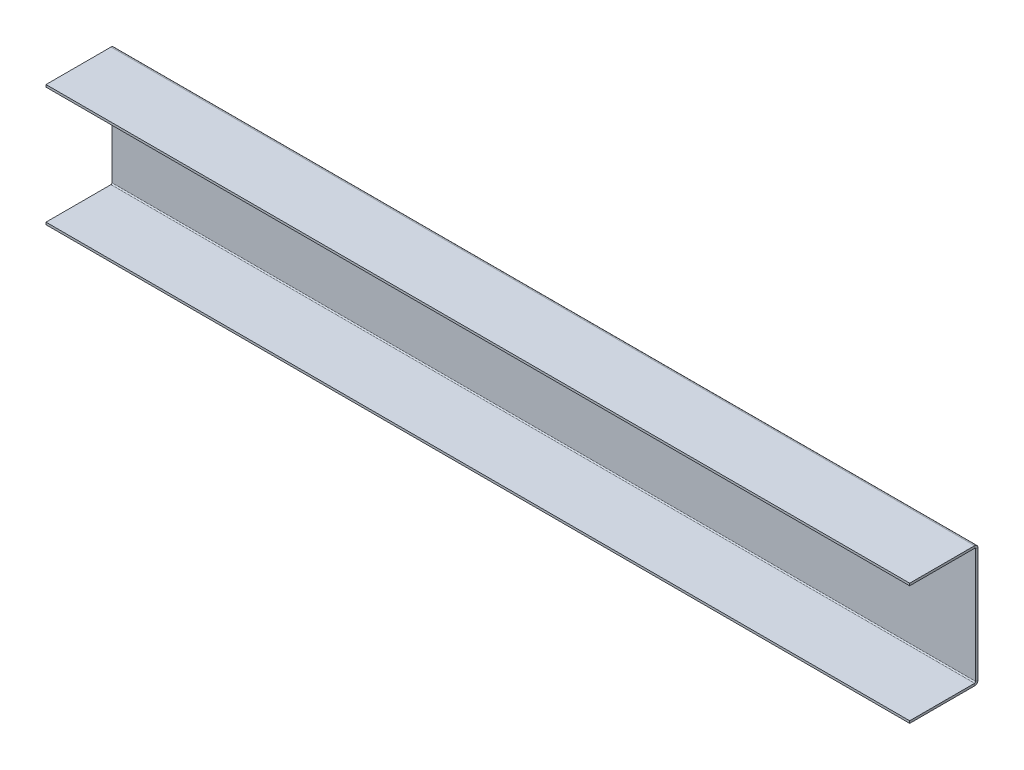
ISO-10303-21;
HEADER;
FILE_DESCRIPTION(('STEP AP214'),'2;1');
FILE_NAME('part.step','',(''),(''),'','','');
FILE_SCHEMA(('AUTOMOTIVE_DESIGN { 1 0 10303 214 1 1 1 1 }'));
ENDSEC;
DATA;
#1=APPLICATION_CONTEXT('core data for automotive mechanical design processes');
#2=APPLICATION_PROTOCOL_DEFINITION('international standard','automotive_design',2000,#1);
#3=PRODUCT_CONTEXT('',#1,'mechanical');
#4=PRODUCT('Part','Part','',(#3));
#5=PRODUCT_RELATED_PRODUCT_CATEGORY('part','',(#4));
#6=PRODUCT_DEFINITION_FORMATION('','',#4);
#7=PRODUCT_DEFINITION_CONTEXT('part definition',#1,'design');
#8=PRODUCT_DEFINITION('design','',#6,#7);
#9=PRODUCT_DEFINITION_SHAPE('','',#8);
#10=(LENGTH_UNIT() NAMED_UNIT(*) SI_UNIT(.MILLI.,.METRE.));
#11=(NAMED_UNIT(*) PLANE_ANGLE_UNIT() SI_UNIT($,.RADIAN.));
#12=(NAMED_UNIT(*) SI_UNIT($,.STERADIAN.) SOLID_ANGLE_UNIT());
#13=UNCERTAINTY_MEASURE_WITH_UNIT(LENGTH_MEASURE(1.E-05),#10,'distance_accuracy_value','');
#14=(GEOMETRIC_REPRESENTATION_CONTEXT(3) GLOBAL_UNCERTAINTY_ASSIGNED_CONTEXT((#13)) GLOBAL_UNIT_ASSIGNED_CONTEXT((#10,
#11,#12)) REPRESENTATION_CONTEXT('',''));
#15=CARTESIAN_POINT('',(0.,0.,0.));
#16=DIRECTION('',(0.,0.,1.));
#17=DIRECTION('',(1.,0.,0.));
#18=AXIS2_PLACEMENT_3D('',#15,#16,#17);
#19=CARTESIAN_POINT('',(0.,0.,-1.5));
#20=DIRECTION('',(0.,0.,-1.));
#21=DIRECTION('',(-1.,0.,0.));
#22=AXIS2_PLACEMENT_3D('',#19,#20,#21);
#23=PLANE('',#22);
#24=DIRECTION('',(0.,1.,0.));
#25=VECTOR('',#24,1.);
#26=CARTESIAN_POINT('',(284.5,-40.,-1.5));
#27=LINE('',#26,#25);
#28=CARTESIAN_POINT('',(284.5,-37.7634,-1.5));
#29=VERTEX_POINT('',#28);
#30=CARTESIAN_POINT('',(284.5,37.7634,-1.5));
#31=VERTEX_POINT('',#30);
#32=EDGE_CURVE('E90',#29,#31,#27,.T.);
#33=ORIENTED_EDGE('',*,*,#32,.F.);
#34=DIRECTION('',(1.,0.,0.));
#35=VECTOR('',#34,1.);
#36=CARTESIAN_POINT('',(284.5,-37.7634,-1.5));
#37=LINE('',#36,#35);
#38=CARTESIAN_POINT('',(-284.5,-37.7634,-1.5));
#39=VERTEX_POINT('',#38);
#40=EDGE_CURVE('E213',#29,#39,#37,.F.);
#41=ORIENTED_EDGE('',*,*,#40,.T.);
#42=DIRECTION('',(0.,-1.,0.));
#43=VECTOR('',#42,1.);
#44=CARTESIAN_POINT('',(-284.5,-40.,-1.5));
#45=LINE('',#44,#43);
#46=CARTESIAN_POINT('',(-284.5,37.7634,-1.49999999999999));
#47=VERTEX_POINT('',#46);
#48=EDGE_CURVE('E13',#47,#39,#45,.T.);
#49=ORIENTED_EDGE('',*,*,#48,.F.);
#50=DIRECTION('',(-1.,0.,0.));
#51=VECTOR('',#50,1.);
#52=CARTESIAN_POINT('',(-284.5,37.7634,-1.49999999999999));
#53=LINE('',#52,#51);
#54=EDGE_CURVE('E264',#47,#31,#53,.F.);
#55=ORIENTED_EDGE('',*,*,#54,.T.);
#56=EDGE_LOOP('',(#33,#41,#49,#55));
#57=FACE_BOUND('',#56,.T.);
#58=ADVANCED_FACE('F81',(#57),#23,.T.);
#59=CARTESIAN_POINT('',(0.,0.,0.));
#60=DIRECTION('',(0.,0.,-1.));
#61=DIRECTION('',(-1.,0.,0.));
#62=AXIS2_PLACEMENT_3D('',#59,#60,#61);
#63=PLANE('',#62);
#64=DIRECTION('',(1.,0.,0.));
#65=VECTOR('',#64,1.);
#66=CARTESIAN_POINT('',(284.5,-37.7634,0.));
#67=LINE('',#66,#65);
#68=CARTESIAN_POINT('',(284.5,-37.7634,0.));
#69=VERTEX_POINT('',#68);
#70=CARTESIAN_POINT('',(-284.5,-37.7634,0.));
#71=VERTEX_POINT('',#70);
#72=EDGE_CURVE('E224',#69,#71,#67,.F.);
#73=ORIENTED_EDGE('',*,*,#72,.F.);
#74=DIRECTION('',(0.,1.,0.));
#75=VECTOR('',#74,1.);
#76=CARTESIAN_POINT('',(284.5,-40.,0.));
#77=LINE('',#76,#75);
#78=CARTESIAN_POINT('',(284.5,37.7634,0.));
#79=VERTEX_POINT('',#78);
#80=EDGE_CURVE('E281',#69,#79,#77,.T.);
#81=ORIENTED_EDGE('',*,*,#80,.T.);
#82=DIRECTION('',(-1.,0.,0.));
#83=VECTOR('',#82,1.);
#84=CARTESIAN_POINT('',(-284.5,37.7634,0.));
#85=LINE('',#84,#83);
#86=CARTESIAN_POINT('',(-284.5,37.7634,0.));
#87=VERTEX_POINT('',#86);
#88=EDGE_CURVE('E275',#87,#79,#85,.F.);
#89=ORIENTED_EDGE('',*,*,#88,.F.);
#90=DIRECTION('',(0.,-1.,0.));
#91=VECTOR('',#90,1.);
#92=CARTESIAN_POINT('',(-284.5,-40.,0.));
#93=LINE('',#92,#91);
#94=EDGE_CURVE('E85',#87,#71,#93,.T.);
#95=ORIENTED_EDGE('',*,*,#94,.T.);
#96=EDGE_LOOP('',(#73,#81,#89,#95));
#97=FACE_BOUND('',#96,.T.);
#98=ADVANCED_FACE('F293',(#97),#63,.F.);
#99=CARTESIAN_POINT('',(284.5,-40.,-1.5));
#100=DIRECTION('',(1.,0.,0.));
#101=DIRECTION('',(0.,0.,-1.));
#102=AXIS2_PLACEMENT_3D('',#99,#100,#101);
#103=PLANE('',#102);
#104=ORIENTED_EDGE('',*,*,#80,.F.);
#105=DIRECTION('',(0.,0.,-1.));
#106=VECTOR('',#105,1.);
#107=CARTESIAN_POINT('',(284.5,-37.7634,0.));
#108=LINE('',#107,#106);
#109=EDGE_CURVE('E218',#69,#29,#108,.T.);
#110=ORIENTED_EDGE('',*,*,#109,.T.);
#111=ORIENTED_EDGE('',*,*,#32,.T.);
#112=DIRECTION('',(0.,0.,-1.));
#113=VECTOR('',#112,1.);
#114=CARTESIAN_POINT('',(284.5,37.7634,0.));
#115=LINE('',#114,#113);
#116=EDGE_CURVE('E279',#79,#31,#115,.T.);
#117=ORIENTED_EDGE('',*,*,#116,.F.);
#118=EDGE_LOOP('',(#104,#110,#111,#117));
#119=FACE_BOUND('',#118,.T.);
#120=ADVANCED_FACE('F83',(#119),#103,.T.);
#121=CARTESIAN_POINT('',(-284.5,-40.,-1.5));
#122=DIRECTION('',(-1.,0.,0.));
#123=DIRECTION('',(0.,0.,1.));
#124=AXIS2_PLACEMENT_3D('',#121,#122,#123);
#125=PLANE('',#124);
#126=DIRECTION('',(0.,0.,-1.));
#127=VECTOR('',#126,1.);
#128=CARTESIAN_POINT('',(-284.5,-37.7634,0.));
#129=LINE('',#128,#127);
#130=EDGE_CURVE('E229',#71,#39,#129,.T.);
#131=ORIENTED_EDGE('',*,*,#130,.F.);
#132=ORIENTED_EDGE('',*,*,#94,.F.);
#133=DIRECTION('',(0.,0.,-1.));
#134=VECTOR('',#133,1.);
#135=CARTESIAN_POINT('',(-284.5,37.7634,0.));
#136=LINE('',#135,#134);
#137=EDGE_CURVE('E269',#87,#47,#136,.T.);
#138=ORIENTED_EDGE('',*,*,#137,.T.);
#139=ORIENTED_EDGE('',*,*,#48,.T.);
#140=EDGE_LOOP('',(#131,#132,#138,#139));
#141=FACE_BOUND('',#140,.T.);
#142=ADVANCED_FACE('F296',(#141),#125,.T.);
#143=CARTESIAN_POINT('',(284.5,37.7634,0.736600000000006));
#144=DIRECTION('',(1.,0.,0.));
#145=DIRECTION('',(0.,0.,-1.));
#146=AXIS2_PLACEMENT_3D('',#143,#144,#145);
#147=PLANE('',#146);
#148=DIRECTION('',(0.,-1.,0.));
#149=VECTOR('',#148,1.);
#150=CARTESIAN_POINT('',(284.5,40.,0.736599999999992));
#151=LINE('',#150,#149);
#152=CARTESIAN_POINT('',(284.5,38.5,0.736600000000004));
#153=VERTEX_POINT('',#152);
#154=CARTESIAN_POINT('',(284.5,40.,0.736599999999999));
#155=VERTEX_POINT('',#154);
#156=EDGE_CURVE('E231',#153,#155,#151,.F.);
#157=ORIENTED_EDGE('',*,*,#156,.F.);
#158=CARTESIAN_POINT('',(284.5,37.7634,0.736600000000006));
#159=DIRECTION('',(-1.,0.,0.));
#160=DIRECTION('',(0.,0.,1.));
#161=AXIS2_PLACEMENT_3D('',#158,#159,#160);
#162=CIRCLE('',#161,0.736599999999997);
#163=EDGE_CURVE('E272',#79,#153,#162,.F.);
#164=ORIENTED_EDGE('',*,*,#163,.F.);
#165=ORIENTED_EDGE('',*,*,#116,.T.);
#166=CARTESIAN_POINT('',(284.5,37.7634,0.736600000000006));
#167=DIRECTION('',(-1.,0.,0.));
#168=DIRECTION('',(0.,0.,1.));
#169=AXIS2_PLACEMENT_3D('',#166,#167,#168);
#170=CIRCLE('',#169,2.2366);
#171=EDGE_CURVE('E98',#31,#155,#170,.F.);
#172=ORIENTED_EDGE('',*,*,#171,.T.);
#173=EDGE_LOOP('',(#157,#164,#165,#172));
#174=FACE_BOUND('',#173,.T.);
#175=ADVANCED_FACE('F311',(#174),#147,.T.);
#176=CARTESIAN_POINT('',(-284.5,37.7634,0.736600000000006));
#177=DIRECTION('',(1.,0.,0.));
#178=DIRECTION('',(0.,0.,-1.));
#179=AXIS2_PLACEMENT_3D('',#176,#177,#178);
#180=PLANE('',#179);
#181=CARTESIAN_POINT('',(-284.5,37.7634,0.736600000000006));
#182=DIRECTION('',(-1.,0.,0.));
#183=DIRECTION('',(0.,0.,1.));
#184=AXIS2_PLACEMENT_3D('',#181,#182,#183);
#185=CIRCLE('',#184,0.736599999999997);
#186=CARTESIAN_POINT('',(-284.5,38.5,0.736600000000004));
#187=VERTEX_POINT('',#186);
#188=EDGE_CURVE('E237',#187,#87,#185,.T.);
#189=ORIENTED_EDGE('',*,*,#188,.F.);
#190=DIRECTION('',(0.,-1.,0.));
#191=VECTOR('',#190,1.);
#192=CARTESIAN_POINT('',(-284.5,38.5,0.736600000000011));
#193=LINE('',#192,#191);
#194=CARTESIAN_POINT('',(-284.5,40.,0.736600000000006));
#195=VERTEX_POINT('',#194);
#196=EDGE_CURVE('E257',#187,#195,#193,.F.);
#197=ORIENTED_EDGE('',*,*,#196,.T.);
#198=CARTESIAN_POINT('',(-284.5,37.7634,0.736600000000006));
#199=DIRECTION('',(-1.,0.,0.));
#200=DIRECTION('',(0.,0.,1.));
#201=AXIS2_PLACEMENT_3D('',#198,#199,#200);
#202=CIRCLE('',#201,2.2366);
#203=EDGE_CURVE('E267',#195,#47,#202,.T.);
#204=ORIENTED_EDGE('',*,*,#203,.T.);
#205=ORIENTED_EDGE('',*,*,#137,.F.);
#206=EDGE_LOOP('',(#189,#197,#204,#205));
#207=FACE_BOUND('',#206,.T.);
#208=ADVANCED_FACE('F335',(#207),#180,.F.);
#209=CARTESIAN_POINT('',(-284.5,37.7634,0.736600000000006));
#210=DIRECTION('',(-1.,0.,0.));
#211=DIRECTION('',(0.,1.,0.));
#212=AXIS2_PLACEMENT_3D('',#209,#210,#211);
#213=CYLINDRICAL_SURFACE('',#212,2.2366);
#214=ORIENTED_EDGE('',*,*,#54,.F.);
#215=ORIENTED_EDGE('',*,*,#203,.F.);
#216=DIRECTION('',(-1.,0.,0.));
#217=VECTOR('',#216,1.);
#218=CARTESIAN_POINT('',(284.5,40.,0.736599999999992));
#219=LINE('',#218,#217);
#220=EDGE_CURVE('E255',#195,#155,#219,.F.);
#221=ORIENTED_EDGE('',*,*,#220,.T.);
#222=ORIENTED_EDGE('',*,*,#171,.F.);
#223=EDGE_LOOP('',(#214,#215,#221,#222));
#224=FACE_BOUND('',#223,.T.);
#225=ADVANCED_FACE('F338',(#224),#213,.T.);
#226=CARTESIAN_POINT('',(-284.5,37.7634,0.736600000000006));
#227=DIRECTION('',(-1.,0.,0.));
#228=DIRECTION('',(0.,1.,0.));
#229=AXIS2_PLACEMENT_3D('',#226,#227,#228);
#230=CYLINDRICAL_SURFACE('',#229,0.736599999999997);
#231=ORIENTED_EDGE('',*,*,#88,.T.);
#232=ORIENTED_EDGE('',*,*,#163,.T.);
#233=DIRECTION('',(-1.,0.,0.));
#234=VECTOR('',#233,1.);
#235=CARTESIAN_POINT('',(284.5,38.5,0.736599999999997));
#236=LINE('',#235,#234);
#237=EDGE_CURVE('E260',#153,#187,#236,.T.);
#238=ORIENTED_EDGE('',*,*,#237,.T.);
#239=ORIENTED_EDGE('',*,*,#188,.T.);
#240=EDGE_LOOP('',(#231,#232,#238,#239));
#241=FACE_BOUND('',#240,.T.);
#242=ADVANCED_FACE('F314',(#241),#230,.F.);
#243=CARTESIAN_POINT('',(284.5,40.,0.));
#244=DIRECTION('',(-1.,0.,0.));
#245=DIRECTION('',(0.,0.,1.));
#246=AXIS2_PLACEMENT_3D('',#243,#244,#245);
#247=PLANE('',#246);
#248=ORIENTED_EDGE('',*,*,#156,.T.);
#249=DIRECTION('',(0.,0.,-1.));
#250=VECTOR('',#249,1.);
#251=CARTESIAN_POINT('',(284.5,40.,-1.45610248110296E-13));
#252=LINE('',#251,#250);
#253=CARTESIAN_POINT('',(284.5,40.0000000000002,43.5));
#254=VERTEX_POINT('',#253);
#255=EDGE_CURVE('E245',#254,#155,#252,.T.);
#256=ORIENTED_EDGE('',*,*,#255,.F.);
#257=DIRECTION('',(0.,-1.,0.));
#258=VECTOR('',#257,1.);
#259=CARTESIAN_POINT('',(284.5,40.0000000000002,43.5));
#260=LINE('',#259,#258);
#261=CARTESIAN_POINT('',(284.5,38.5000000000001,43.5));
#262=VERTEX_POINT('',#261);
#263=EDGE_CURVE('E238',#254,#262,#260,.T.);
#264=ORIENTED_EDGE('',*,*,#263,.T.);
#265=DIRECTION('',(0.,0.,1.));
#266=VECTOR('',#265,1.);
#267=CARTESIAN_POINT('',(284.5,38.5,0.));
#268=LINE('',#267,#266);
#269=EDGE_CURVE('E252',#262,#153,#268,.F.);
#270=ORIENTED_EDGE('',*,*,#269,.T.);
#271=EDGE_LOOP('',(#248,#256,#264,#270));
#272=FACE_BOUND('',#271,.T.);
#273=ADVANCED_FACE('F322',(#272),#247,.F.);
#274=CARTESIAN_POINT('',(-284.5,40.0000000000002,43.5));
#275=DIRECTION('',(1.,0.,0.));
#276=DIRECTION('',(0.,0.,-1.));
#277=AXIS2_PLACEMENT_3D('',#274,#275,#276);
#278=PLANE('',#277);
#279=ORIENTED_EDGE('',*,*,#196,.F.);
#280=DIRECTION('',(0.,0.,-1.));
#281=VECTOR('',#280,1.);
#282=CARTESIAN_POINT('',(-284.5,38.5000000000001,43.5));
#283=LINE('',#282,#281);
#284=CARTESIAN_POINT('',(-284.5,38.5000000000001,43.5));
#285=VERTEX_POINT('',#284);
#286=EDGE_CURVE('E250',#187,#285,#283,.F.);
#287=ORIENTED_EDGE('',*,*,#286,.T.);
#288=DIRECTION('',(0.,-1.,0.));
#289=VECTOR('',#288,1.);
#290=CARTESIAN_POINT('',(-284.5,40.0000000000002,43.5));
#291=LINE('',#290,#289);
#292=CARTESIAN_POINT('',(-284.5,40.0000000000002,43.5));
#293=VERTEX_POINT('',#292);
#294=EDGE_CURVE('E234',#293,#285,#291,.T.);
#295=ORIENTED_EDGE('',*,*,#294,.F.);
#296=DIRECTION('',(0.,0.,1.));
#297=VECTOR('',#296,1.);
#298=CARTESIAN_POINT('',(-284.5,40.,-1.45610248110296E-13));
#299=LINE('',#298,#297);
#300=EDGE_CURVE('E243',#195,#293,#299,.T.);
#301=ORIENTED_EDGE('',*,*,#300,.F.);
#302=EDGE_LOOP('',(#279,#287,#295,#301));
#303=FACE_BOUND('',#302,.T.);
#304=ADVANCED_FACE('F332',(#303),#278,.F.);
#305=CARTESIAN_POINT('',(0.,40.,-1.45610248110296E-13));
#306=DIRECTION('',(0.,-1.,0.));
#307=DIRECTION('',(0.,0.,-1.));
#308=AXIS2_PLACEMENT_3D('',#305,#306,#307);
#309=PLANE('',#308);
#310=ORIENTED_EDGE('',*,*,#220,.F.);
#311=ORIENTED_EDGE('',*,*,#300,.T.);
#312=DIRECTION('',(1.,0.,0.));
#313=VECTOR('',#312,1.);
#314=CARTESIAN_POINT('',(0.,40.0000000000002,43.5));
#315=LINE('',#314,#313);
#316=EDGE_CURVE('E241',#293,#254,#315,.T.);
#317=ORIENTED_EDGE('',*,*,#316,.T.);
#318=ORIENTED_EDGE('',*,*,#255,.T.);
#319=EDGE_LOOP('',(#310,#311,#317,#318));
#320=FACE_BOUND('',#319,.T.);
#321=ADVANCED_FACE('F337',(#320),#309,.F.);
#322=CARTESIAN_POINT('',(0.,38.5,-1.40373026102031E-13));
#323=DIRECTION('',(0.,-1.,0.));
#324=DIRECTION('',(0.,0.,-1.));
#325=AXIS2_PLACEMENT_3D('',#322,#323,#324);
#326=PLANE('',#325);
#327=ORIENTED_EDGE('',*,*,#286,.F.);
#328=ORIENTED_EDGE('',*,*,#237,.F.);
#329=ORIENTED_EDGE('',*,*,#269,.F.);
#330=DIRECTION('',(-1.,0.,0.));
#331=VECTOR('',#330,1.);
#332=CARTESIAN_POINT('',(284.5,38.5000000000001,43.5));
#333=LINE('',#332,#331);
#334=EDGE_CURVE('E248',#285,#262,#333,.F.);
#335=ORIENTED_EDGE('',*,*,#334,.F.);
#336=EDGE_LOOP('',(#327,#328,#329,#335));
#337=FACE_BOUND('',#336,.T.);
#338=ADVANCED_FACE('F319',(#337),#326,.T.);
#339=CARTESIAN_POINT('',(284.5,40.0000000000002,43.5));
#340=DIRECTION('',(0.,0.,-1.));
#341=DIRECTION('',(0.,1.,0.));
#342=AXIS2_PLACEMENT_3D('',#339,#340,#341);
#343=PLANE('',#342);
#344=ORIENTED_EDGE('',*,*,#334,.T.);
#345=ORIENTED_EDGE('',*,*,#263,.F.);
#346=ORIENTED_EDGE('',*,*,#316,.F.);
#347=ORIENTED_EDGE('',*,*,#294,.T.);
#348=EDGE_LOOP('',(#344,#345,#346,#347));
#349=FACE_BOUND('',#348,.T.);
#350=ADVANCED_FACE('F327',(#349),#343,.F.);
#351=CARTESIAN_POINT('',(-284.5,-37.7634,0.736599999999993));
#352=DIRECTION('',(-1.,0.,0.));
#353=DIRECTION('',(0.,0.,1.));
#354=AXIS2_PLACEMENT_3D('',#351,#352,#353);
#355=PLANE('',#354);
#356=DIRECTION('',(0.,1.,0.));
#357=VECTOR('',#356,1.);
#358=CARTESIAN_POINT('',(-284.5,-40.,0.736599999999992));
#359=LINE('',#358,#357);
#360=CARTESIAN_POINT('',(-284.5,-38.5,0.73659999999999));
#361=VERTEX_POINT('',#360);
#362=CARTESIAN_POINT('',(-284.5,-40.,0.736599999999985));
#363=VERTEX_POINT('',#362);
#364=EDGE_CURVE('E196',#361,#363,#359,.F.);
#365=ORIENTED_EDGE('',*,*,#364,.F.);
#366=CARTESIAN_POINT('',(-284.5,-37.7634,0.736599999999993));
#367=DIRECTION('',(1.,0.,0.));
#368=DIRECTION('',(0.,0.,-1.));
#369=AXIS2_PLACEMENT_3D('',#366,#367,#368);
#370=CIRCLE('',#369,0.736599999999997);
#371=EDGE_CURVE('E221',#71,#361,#370,.F.);
#372=ORIENTED_EDGE('',*,*,#371,.F.);
#373=ORIENTED_EDGE('',*,*,#130,.T.);
#374=CARTESIAN_POINT('',(-284.5,-37.7634,0.736599999999993));
#375=DIRECTION('',(1.,0.,0.));
#376=DIRECTION('',(0.,0.,-1.));
#377=AXIS2_PLACEMENT_3D('',#374,#375,#376);
#378=CIRCLE('',#377,2.2366);
#379=EDGE_CURVE('E106',#39,#363,#378,.F.);
#380=ORIENTED_EDGE('',*,*,#379,.T.);
#381=EDGE_LOOP('',(#365,#372,#373,#380));
#382=FACE_BOUND('',#381,.T.);
#383=ADVANCED_FACE('F300',(#382),#355,.T.);
#384=CARTESIAN_POINT('',(284.5,-37.7634,0.736599999999993));
#385=DIRECTION('',(-1.,0.,0.));
#386=DIRECTION('',(0.,0.,1.));
#387=AXIS2_PLACEMENT_3D('',#384,#385,#386);
#388=PLANE('',#387);
#389=CARTESIAN_POINT('',(284.5,-37.7634,0.736599999999993));
#390=DIRECTION('',(1.,0.,0.));
#391=DIRECTION('',(0.,0.,-1.));
#392=AXIS2_PLACEMENT_3D('',#389,#390,#391);
#393=CIRCLE('',#392,0.736599999999997);
#394=CARTESIAN_POINT('',(284.5,-38.5,0.73659999999999));
#395=VERTEX_POINT('',#394);
#396=EDGE_CURVE('E226',#395,#69,#393,.T.);
#397=ORIENTED_EDGE('',*,*,#396,.F.);
#398=DIRECTION('',(0.,1.,0.));
#399=VECTOR('',#398,1.);
#400=CARTESIAN_POINT('',(284.5,-38.5,0.736599999999983));
#401=LINE('',#400,#399);
#402=CARTESIAN_POINT('',(284.5,-40.,0.736599999999978));
#403=VERTEX_POINT('',#402);
#404=EDGE_CURVE('E207',#395,#403,#401,.F.);
#405=ORIENTED_EDGE('',*,*,#404,.T.);
#406=CARTESIAN_POINT('',(284.5,-37.7634,0.736599999999993));
#407=DIRECTION('',(1.,0.,0.));
#408=DIRECTION('',(0.,0.,-1.));
#409=AXIS2_PLACEMENT_3D('',#406,#407,#408);
#410=CIRCLE('',#409,2.2366);
#411=EDGE_CURVE('E216',#403,#29,#410,.T.);
#412=ORIENTED_EDGE('',*,*,#411,.T.);
#413=ORIENTED_EDGE('',*,*,#109,.F.);
#414=EDGE_LOOP('',(#397,#405,#412,#413));
#415=FACE_BOUND('',#414,.T.);
#416=ADVANCED_FACE('F306',(#415),#388,.F.);
#417=CARTESIAN_POINT('',(284.5,-37.7634,0.736599999999993));
#418=DIRECTION('',(1.,0.,0.));
#419=DIRECTION('',(0.,-1.,0.));
#420=AXIS2_PLACEMENT_3D('',#417,#418,#419);
#421=CYLINDRICAL_SURFACE('',#420,2.2366);
#422=ORIENTED_EDGE('',*,*,#40,.F.);
#423=ORIENTED_EDGE('',*,*,#411,.F.);
#424=DIRECTION('',(1.,0.,0.));
#425=VECTOR('',#424,1.);
#426=CARTESIAN_POINT('',(-284.5,-40.,0.736599999999992));
#427=LINE('',#426,#425);
#428=EDGE_CURVE('E205',#403,#363,#427,.F.);
#429=ORIENTED_EDGE('',*,*,#428,.T.);
#430=ORIENTED_EDGE('',*,*,#379,.F.);
#431=EDGE_LOOP('',(#422,#423,#429,#430));
#432=FACE_BOUND('',#431,.T.);
#433=ADVANCED_FACE('F303',(#432),#421,.T.);
#434=CARTESIAN_POINT('',(284.5,-37.7634,0.736599999999993));
#435=DIRECTION('',(1.,0.,0.));
#436=DIRECTION('',(0.,-1.,0.));
#437=AXIS2_PLACEMENT_3D('',#434,#435,#436);
#438=CYLINDRICAL_SURFACE('',#437,0.736599999999997);
#439=ORIENTED_EDGE('',*,*,#72,.T.);
#440=ORIENTED_EDGE('',*,*,#371,.T.);
#441=DIRECTION('',(1.,0.,0.));
#442=VECTOR('',#441,1.);
#443=CARTESIAN_POINT('',(-284.5,-38.5,0.736599999999997));
#444=LINE('',#443,#442);
#445=EDGE_CURVE('E210',#361,#395,#444,.T.);
#446=ORIENTED_EDGE('',*,*,#445,.T.);
#447=ORIENTED_EDGE('',*,*,#396,.T.);
#448=EDGE_LOOP('',(#439,#440,#446,#447));
#449=FACE_BOUND('',#448,.T.);
#450=ADVANCED_FACE('F474',(#449),#438,.F.);
#451=CARTESIAN_POINT('',(-284.5,-40.,0.));
#452=DIRECTION('',(1.,0.,0.));
#453=DIRECTION('',(0.,0.,-1.));
#454=AXIS2_PLACEMENT_3D('',#451,#452,#453);
#455=PLANE('',#454);
#456=ORIENTED_EDGE('',*,*,#364,.T.);
#457=DIRECTION('',(0.,0.,-1.));
#458=VECTOR('',#457,1.);
#459=CARTESIAN_POINT('',(-284.5,-40.,-1.45610248110296E-13));
#460=LINE('',#459,#458);
#461=CARTESIAN_POINT('',(-284.5,-40.0000000000002,43.5));
#462=VERTEX_POINT('',#461);
#463=EDGE_CURVE('E177',#462,#363,#460,.T.);
#464=ORIENTED_EDGE('',*,*,#463,.F.);
#465=DIRECTION('',(0.,1.,0.));
#466=VECTOR('',#465,1.);
#467=CARTESIAN_POINT('',(-284.5,-40.0000000000002,43.5));
#468=LINE('',#467,#466);
#469=CARTESIAN_POINT('',(-284.5,-38.5000000000001,43.5));
#470=VERTEX_POINT('',#469);
#471=EDGE_CURVE('E183',#462,#470,#468,.T.);
#472=ORIENTED_EDGE('',*,*,#471,.T.);
#473=DIRECTION('',(0.,0.,1.));
#474=VECTOR('',#473,1.);
#475=CARTESIAN_POINT('',(-284.5,-38.5,0.));
#476=LINE('',#475,#474);
#477=EDGE_CURVE('E203',#470,#361,#476,.F.);
#478=ORIENTED_EDGE('',*,*,#477,.T.);
#479=EDGE_LOOP('',(#456,#464,#472,#478));
#480=FACE_BOUND('',#479,.T.);
#481=ADVANCED_FACE('F195',(#480),#455,.F.);
#482=CARTESIAN_POINT('',(284.5,-40.0000000000002,43.5));
#483=DIRECTION('',(-1.,0.,0.));
#484=DIRECTION('',(0.,0.,1.));
#485=AXIS2_PLACEMENT_3D('',#482,#483,#484);
#486=PLANE('',#485);
#487=ORIENTED_EDGE('',*,*,#404,.F.);
#488=DIRECTION('',(0.,0.,-1.));
#489=VECTOR('',#488,1.);
#490=CARTESIAN_POINT('',(284.5,-38.5000000000001,43.5));
#491=LINE('',#490,#489);
#492=CARTESIAN_POINT('',(284.5,-38.5000000000001,43.5));
#493=VERTEX_POINT('',#492);
#494=EDGE_CURVE('E199',#395,#493,#491,.F.);
#495=ORIENTED_EDGE('',*,*,#494,.T.);
#496=DIRECTION('',(0.,1.,0.));
#497=VECTOR('',#496,1.);
#498=CARTESIAN_POINT('',(284.5,-40.0000000000002,43.5));
#499=LINE('',#498,#497);
#500=CARTESIAN_POINT('',(284.5,-40.0000000000002,43.5));
#501=VERTEX_POINT('',#500);
#502=EDGE_CURVE('E192',#501,#493,#499,.T.);
#503=ORIENTED_EDGE('',*,*,#502,.F.);
#504=DIRECTION('',(0.,0.,1.));
#505=VECTOR('',#504,1.);
#506=CARTESIAN_POINT('',(284.5,-40.,-1.45610248110296E-13));
#507=LINE('',#506,#505);
#508=EDGE_CURVE('E179',#403,#501,#507,.T.);
#509=ORIENTED_EDGE('',*,*,#508,.F.);
#510=EDGE_LOOP('',(#487,#495,#503,#509));
#511=FACE_BOUND('',#510,.T.);
#512=ADVANCED_FACE('F494',(#511),#486,.F.);
#513=CARTESIAN_POINT('',(0.,-40.,-1.45610248110296E-13));
#514=DIRECTION('',(0.,1.,0.));
#515=DIRECTION('',(0.,0.,1.));
#516=AXIS2_PLACEMENT_3D('',#513,#514,#515);
#517=PLANE('',#516);
#518=ORIENTED_EDGE('',*,*,#428,.F.);
#519=ORIENTED_EDGE('',*,*,#508,.T.);
#520=DIRECTION('',(-1.,0.,0.));
#521=VECTOR('',#520,1.);
#522=CARTESIAN_POINT('',(0.,-40.0000000000002,43.5));
#523=LINE('',#522,#521);
#524=EDGE_CURVE('E172',#501,#462,#523,.T.);
#525=ORIENTED_EDGE('',*,*,#524,.T.);
#526=ORIENTED_EDGE('',*,*,#463,.T.);
#527=EDGE_LOOP('',(#518,#519,#525,#526));
#528=FACE_BOUND('',#527,.T.);
#529=ADVANCED_FACE('F175',(#528),#517,.F.);
#530=CARTESIAN_POINT('',(0.,-38.5,-1.40373026102031E-13));
#531=DIRECTION('',(0.,1.,0.));
#532=DIRECTION('',(0.,0.,1.));
#533=AXIS2_PLACEMENT_3D('',#530,#531,#532);
#534=PLANE('',#533);
#535=ORIENTED_EDGE('',*,*,#494,.F.);
#536=ORIENTED_EDGE('',*,*,#445,.F.);
#537=ORIENTED_EDGE('',*,*,#477,.F.);
#538=DIRECTION('',(1.,0.,0.));
#539=VECTOR('',#538,1.);
#540=CARTESIAN_POINT('',(-284.5,-38.5000000000001,43.5));
#541=LINE('',#540,#539);
#542=EDGE_CURVE('E188',#493,#470,#541,.F.);
#543=ORIENTED_EDGE('',*,*,#542,.F.);
#544=EDGE_LOOP('',(#535,#536,#537,#543));
#545=FACE_BOUND('',#544,.T.);
#546=ADVANCED_FACE('F514',(#545),#534,.T.);
#547=CARTESIAN_POINT('',(-284.5,-40.0000000000002,43.5));
#548=DIRECTION('',(0.,0.,-1.));
#549=DIRECTION('',(0.,1.,0.));
#550=AXIS2_PLACEMENT_3D('',#547,#548,#549);
#551=PLANE('',#550);
#552=ORIENTED_EDGE('',*,*,#542,.T.);
#553=ORIENTED_EDGE('',*,*,#471,.F.);
#554=ORIENTED_EDGE('',*,*,#524,.F.);
#555=ORIENTED_EDGE('',*,*,#502,.T.);
#556=EDGE_LOOP('',(#552,#553,#554,#555));
#557=FACE_BOUND('',#556,.T.);
#558=ADVANCED_FACE('F186',(#557),#551,.F.);
#559=CLOSED_SHELL('',(#58,#98,#120,#142,#175,#208,#225,#242,#273,#304,#321,#338,#350,#383,#416,
#433,#450,#481,#512,#529,#546,#558));
#560=MANIFOLD_SOLID_BREP('B2',#559);
#561=ADVANCED_BREP_SHAPE_REPRESENTATION('',(#18,#560),#14);
#562=SHAPE_DEFINITION_REPRESENTATION(#9,#561);
ENDSEC;
END-ISO-10303-21;
